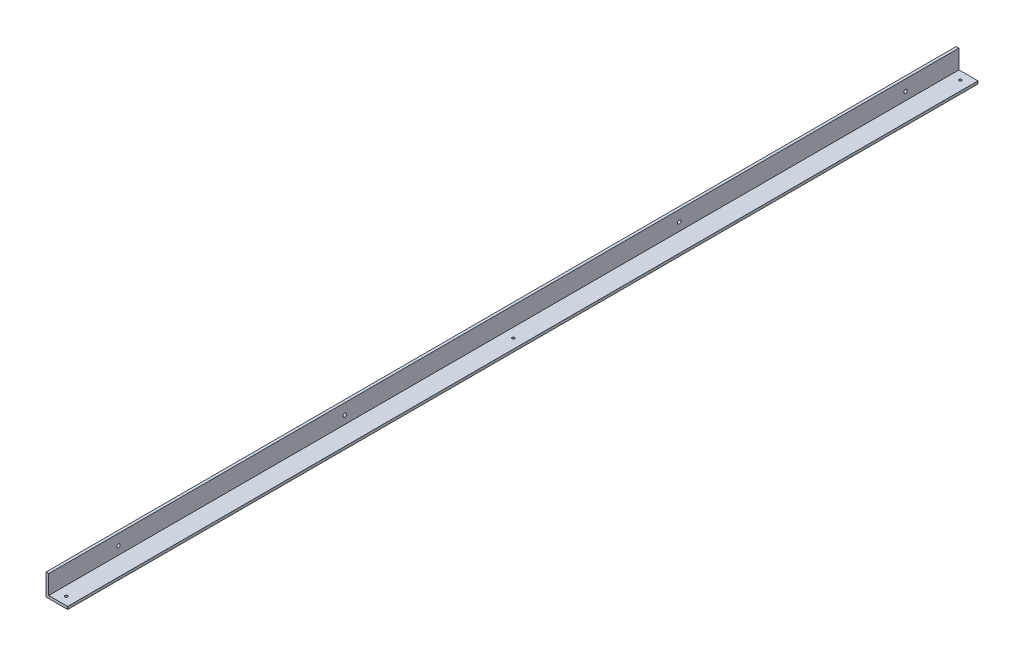
ISO-10303-21;
HEADER;
FILE_DESCRIPTION(('STEP AP214'),'2;1');
FILE_NAME('part.step','',(''),(''),'','','');
FILE_SCHEMA(('AUTOMOTIVE_DESIGN { 1 0 10303 214 1 1 1 1 }'));
ENDSEC;
DATA;
#1=APPLICATION_CONTEXT('core data for automotive mechanical design processes');
#2=APPLICATION_PROTOCOL_DEFINITION('international standard','automotive_design',2000,#1);
#3=PRODUCT_CONTEXT('',#1,'mechanical');
#4=PRODUCT('Part','Part','',(#3));
#5=PRODUCT_RELATED_PRODUCT_CATEGORY('part','',(#4));
#6=PRODUCT_DEFINITION_FORMATION('','',#4);
#7=PRODUCT_DEFINITION_CONTEXT('part definition',#1,'design');
#8=PRODUCT_DEFINITION('design','',#6,#7);
#9=PRODUCT_DEFINITION_SHAPE('','',#8);
#10=(LENGTH_UNIT() NAMED_UNIT(*) SI_UNIT(.MILLI.,.METRE.));
#11=(NAMED_UNIT(*) PLANE_ANGLE_UNIT() SI_UNIT($,.RADIAN.));
#12=(NAMED_UNIT(*) SI_UNIT($,.STERADIAN.) SOLID_ANGLE_UNIT());
#13=UNCERTAINTY_MEASURE_WITH_UNIT(LENGTH_MEASURE(1.E-05),#10,'distance_accuracy_value','');
#14=(GEOMETRIC_REPRESENTATION_CONTEXT(3) GLOBAL_UNCERTAINTY_ASSIGNED_CONTEXT((#13)) GLOBAL_UNIT_ASSIGNED_CONTEXT((#10,
#11,#12)) REPRESENTATION_CONTEXT('',''));
#15=CARTESIAN_POINT('',(0.,0.,0.));
#16=DIRECTION('',(0.,0.,1.));
#17=DIRECTION('',(1.,0.,0.));
#18=AXIS2_PLACEMENT_3D('',#15,#16,#17);
#19=CARTESIAN_POINT('',(0.,0.,3360.));
#20=DIRECTION('',(1.,0.,0.));
#21=DIRECTION('',(0.,0.,-1.));
#22=AXIS2_PLACEMENT_3D('',#19,#20,#21);
#23=PLANE('',#22);
#24=CARTESIAN_POINT('',(0.,40.,3102.5));
#25=DIRECTION('',(-1.,0.,0.));
#26=DIRECTION('',(0.,0.,1.));
#27=AXIS2_PLACEMENT_3D('',#24,#25,#26);
#28=CIRCLE('',#27,6.34999999999972);
#29=CARTESIAN_POINT('',(0.,40.,3108.85));
#30=VERTEX_POINT('',#29);
#31=EDGE_CURVE('E183',#30,#30,#28,.T.);
#32=ORIENTED_EDGE('',*,*,#31,.F.);
#33=EDGE_LOOP('',(#32));
#34=FACE_BOUND('',#33,.T.);
#35=CARTESIAN_POINT('',(0.,40.,2267.5));
#36=DIRECTION('',(-1.,0.,0.));
#37=DIRECTION('',(0.,0.,1.));
#38=AXIS2_PLACEMENT_3D('',#35,#36,#37);
#39=CIRCLE('',#38,6.34999999999972);
#40=CARTESIAN_POINT('',(0.,40.,2273.85));
#41=VERTEX_POINT('',#40);
#42=EDGE_CURVE('E187',#41,#41,#39,.T.);
#43=ORIENTED_EDGE('',*,*,#42,.F.);
#44=EDGE_LOOP('',(#43));
#45=FACE_BOUND('',#44,.T.);
#46=CARTESIAN_POINT('',(0.,40.,1032.5));
#47=DIRECTION('',(-1.,0.,0.));
#48=DIRECTION('',(0.,0.,1.));
#49=AXIS2_PLACEMENT_3D('',#46,#47,#48);
#50=CIRCLE('',#49,6.35000000000016);
#51=CARTESIAN_POINT('',(0.,40.,1038.85));
#52=VERTEX_POINT('',#51);
#53=EDGE_CURVE('E191',#52,#52,#50,.T.);
#54=ORIENTED_EDGE('',*,*,#53,.F.);
#55=EDGE_LOOP('',(#54));
#56=FACE_BOUND('',#55,.T.);
#57=CARTESIAN_POINT('',(0.,40.,197.5));
#58=DIRECTION('',(-1.,0.,0.));
#59=DIRECTION('',(0.,0.,1.));
#60=AXIS2_PLACEMENT_3D('',#57,#58,#59);
#61=CIRCLE('',#60,6.35000000000017);
#62=CARTESIAN_POINT('',(0.,40.,203.85));
#63=VERTEX_POINT('',#62);
#64=EDGE_CURVE('E194',#63,#63,#61,.T.);
#65=ORIENTED_EDGE('',*,*,#64,.F.);
#66=EDGE_LOOP('',(#65));
#67=FACE_BOUND('',#66,.T.);
#68=DIRECTION('',(0.,-1.,0.));
#69=VECTOR('',#68,1.);
#70=CARTESIAN_POINT('',(0.,0.,0.));
#71=LINE('',#70,#69);
#72=CARTESIAN_POINT('',(0.,80.,0.));
#73=VERTEX_POINT('',#72);
#74=CARTESIAN_POINT('',(0.,0.,0.));
#75=VERTEX_POINT('',#74);
#76=EDGE_CURVE('E127',#73,#75,#71,.T.);
#77=ORIENTED_EDGE('',*,*,#76,.T.);
#78=DIRECTION('',(0.,0.,-1.));
#79=VECTOR('',#78,1.);
#80=CARTESIAN_POINT('',(0.,0.,3360.));
#81=LINE('',#80,#79);
#82=CARTESIAN_POINT('',(0.,0.,3360.));
#83=VERTEX_POINT('',#82);
#84=EDGE_CURVE('E11',#83,#75,#81,.T.);
#85=ORIENTED_EDGE('',*,*,#84,.F.);
#86=DIRECTION('',(0.,-1.,0.));
#87=VECTOR('',#86,1.);
#88=CARTESIAN_POINT('',(0.,0.,3360.));
#89=LINE('',#88,#87);
#90=CARTESIAN_POINT('',(0.,80.,3360.));
#91=VERTEX_POINT('',#90);
#92=EDGE_CURVE('E144',#91,#83,#89,.T.);
#93=ORIENTED_EDGE('',*,*,#92,.F.);
#94=DIRECTION('',(0.,0.,-1.));
#95=VECTOR('',#94,1.);
#96=CARTESIAN_POINT('',(0.,80.,3360.));
#97=LINE('',#96,#95);
#98=EDGE_CURVE('E123',#91,#73,#97,.T.);
#99=ORIENTED_EDGE('',*,*,#98,.T.);
#100=EDGE_LOOP('',(#77,#85,#93,#99));
#101=FACE_BOUND('',#100,.T.);
#102=ADVANCED_FACE('F38',(#34,#45,#56,#67,#101),#23,.F.);
#103=CARTESIAN_POINT('',(0.,0.,3360.));
#104=DIRECTION('',(0.,1.,0.));
#105=DIRECTION('',(0.,0.,1.));
#106=AXIS2_PLACEMENT_3D('',#103,#104,#105);
#107=PLANE('',#106);
#108=CARTESIAN_POINT('',(45.,0.,3330.));
#109=DIRECTION('',(0.,1.,0.));
#110=DIRECTION('',(0.,0.,1.));
#111=AXIS2_PLACEMENT_3D('',#108,#109,#110);
#112=CIRCLE('',#111,4.76250000000001);
#113=CARTESIAN_POINT('',(45.,0.,3334.7625));
#114=VERTEX_POINT('',#113);
#115=EDGE_CURVE('E198',#114,#114,#112,.F.);
#116=ORIENTED_EDGE('',*,*,#115,.F.);
#117=EDGE_LOOP('',(#116));
#118=FACE_BOUND('',#117,.T.);
#119=CARTESIAN_POINT('',(45.,0.,1680.));
#120=DIRECTION('',(0.,1.,0.));
#121=DIRECTION('',(0.,0.,1.));
#122=AXIS2_PLACEMENT_3D('',#119,#120,#121);
#123=CIRCLE('',#122,4.76250000000002);
#124=CARTESIAN_POINT('',(45.,0.,1684.7625));
#125=VERTEX_POINT('',#124);
#126=EDGE_CURVE('E240',#125,#125,#123,.F.);
#127=ORIENTED_EDGE('',*,*,#126,.F.);
#128=EDGE_LOOP('',(#127));
#129=FACE_BOUND('',#128,.T.);
#130=CARTESIAN_POINT('',(45.,0.,30.0000000000002));
#131=DIRECTION('',(0.,1.,0.));
#132=DIRECTION('',(0.,0.,1.));
#133=AXIS2_PLACEMENT_3D('',#130,#131,#132);
#134=CIRCLE('',#133,4.7625);
#135=CARTESIAN_POINT('',(45.,0.,34.7625000000003));
#136=VERTEX_POINT('',#135);
#137=EDGE_CURVE('E231',#136,#136,#134,.F.);
#138=ORIENTED_EDGE('',*,*,#137,.F.);
#139=EDGE_LOOP('',(#138));
#140=FACE_BOUND('',#139,.T.);
#141=DIRECTION('',(1.,0.,0.));
#142=VECTOR('',#141,1.);
#143=CARTESIAN_POINT('',(0.,0.,0.));
#144=LINE('',#143,#142);
#145=CARTESIAN_POINT('',(80.,0.,0.));
#146=VERTEX_POINT('',#145);
#147=EDGE_CURVE('E131',#75,#146,#144,.T.);
#148=ORIENTED_EDGE('',*,*,#147,.T.);
#149=DIRECTION('',(0.,0.,-1.));
#150=VECTOR('',#149,1.);
#151=CARTESIAN_POINT('',(80.,0.,3360.));
#152=LINE('',#151,#150);
#153=CARTESIAN_POINT('',(80.,0.,3360.));
#154=VERTEX_POINT('',#153);
#155=EDGE_CURVE('E47',#154,#146,#152,.T.);
#156=ORIENTED_EDGE('',*,*,#155,.F.);
#157=DIRECTION('',(1.,0.,0.));
#158=VECTOR('',#157,1.);
#159=CARTESIAN_POINT('',(0.,0.,3360.));
#160=LINE('',#159,#158);
#161=EDGE_CURVE('E92',#83,#154,#160,.T.);
#162=ORIENTED_EDGE('',*,*,#161,.F.);
#163=ORIENTED_EDGE('',*,*,#84,.T.);
#164=EDGE_LOOP('',(#148,#156,#162,#163));
#165=FACE_BOUND('',#164,.T.);
#166=ADVANCED_FACE('F173',(#118,#129,#140,#165),#107,.F.);
#167=CARTESIAN_POINT('',(80.,10.,3360.));
#168=DIRECTION('',(-1.,0.,0.));
#169=DIRECTION('',(0.,0.,1.));
#170=AXIS2_PLACEMENT_3D('',#167,#168,#169);
#171=PLANE('',#170);
#172=DIRECTION('',(0.,1.,0.));
#173=VECTOR('',#172,1.);
#174=CARTESIAN_POINT('',(80.,10.,0.));
#175=LINE('',#174,#173);
#176=CARTESIAN_POINT('',(80.,10.,0.));
#177=VERTEX_POINT('',#176);
#178=EDGE_CURVE('E135',#146,#177,#175,.T.);
#179=ORIENTED_EDGE('',*,*,#178,.T.);
#180=DIRECTION('',(0.,0.,-1.));
#181=VECTOR('',#180,1.);
#182=CARTESIAN_POINT('',(80.,10.,3360.));
#183=LINE('',#182,#181);
#184=CARTESIAN_POINT('',(80.,10.,3360.));
#185=VERTEX_POINT('',#184);
#186=EDGE_CURVE('E116',#185,#177,#183,.T.);
#187=ORIENTED_EDGE('',*,*,#186,.F.);
#188=DIRECTION('',(0.,1.,0.));
#189=VECTOR('',#188,1.);
#190=CARTESIAN_POINT('',(80.,10.,3360.));
#191=LINE('',#190,#189);
#192=EDGE_CURVE('E105',#154,#185,#191,.T.);
#193=ORIENTED_EDGE('',*,*,#192,.F.);
#194=ORIENTED_EDGE('',*,*,#155,.T.);
#195=EDGE_LOOP('',(#179,#187,#193,#194));
#196=FACE_BOUND('',#195,.T.);
#197=ADVANCED_FACE('F154',(#196),#171,.F.);
#198=CARTESIAN_POINT('',(10.,10.,3360.));
#199=DIRECTION('',(0.,-1.,0.));
#200=DIRECTION('',(0.,0.,-1.));
#201=AXIS2_PLACEMENT_3D('',#198,#199,#200);
#202=PLANE('',#201);
#203=CARTESIAN_POINT('',(45.,10.,3330.));
#204=DIRECTION('',(0.,1.,0.));
#205=DIRECTION('',(0.,0.,1.));
#206=AXIS2_PLACEMENT_3D('',#203,#204,#205);
#207=CIRCLE('',#206,4.76250000000001);
#208=CARTESIAN_POINT('',(45.,10.,3334.7625));
#209=VERTEX_POINT('',#208);
#210=EDGE_CURVE('E205',#209,#209,#207,.T.);
#211=ORIENTED_EDGE('',*,*,#210,.F.);
#212=EDGE_LOOP('',(#211));
#213=FACE_BOUND('',#212,.T.);
#214=CARTESIAN_POINT('',(45.,10.,1680.));
#215=DIRECTION('',(0.,1.,0.));
#216=DIRECTION('',(0.,0.,1.));
#217=AXIS2_PLACEMENT_3D('',#214,#215,#216);
#218=CIRCLE('',#217,4.76250000000002);
#219=CARTESIAN_POINT('',(45.,10.,1684.7625));
#220=VERTEX_POINT('',#219);
#221=EDGE_CURVE('E235',#220,#220,#218,.T.);
#222=ORIENTED_EDGE('',*,*,#221,.F.);
#223=EDGE_LOOP('',(#222));
#224=FACE_BOUND('',#223,.T.);
#225=CARTESIAN_POINT('',(45.,10.,30.0000000000002));
#226=DIRECTION('',(0.,1.,0.));
#227=DIRECTION('',(0.,0.,1.));
#228=AXIS2_PLACEMENT_3D('',#225,#226,#227);
#229=CIRCLE('',#228,4.7625);
#230=CARTESIAN_POINT('',(45.,10.,34.7625000000003));
#231=VERTEX_POINT('',#230);
#232=EDGE_CURVE('E236',#231,#231,#229,.T.);
#233=ORIENTED_EDGE('',*,*,#232,.F.);
#234=EDGE_LOOP('',(#233));
#235=FACE_BOUND('',#234,.T.);
#236=DIRECTION('',(-1.,0.,0.));
#237=VECTOR('',#236,1.);
#238=CARTESIAN_POINT('',(10.,10.,0.));
#239=LINE('',#238,#237);
#240=CARTESIAN_POINT('',(10.,10.,0.));
#241=VERTEX_POINT('',#240);
#242=EDGE_CURVE('E114',#177,#241,#239,.T.);
#243=ORIENTED_EDGE('',*,*,#242,.T.);
#244=DIRECTION('',(0.,0.,-1.));
#245=VECTOR('',#244,1.);
#246=CARTESIAN_POINT('',(10.,10.,3360.));
#247=LINE('',#246,#245);
#248=CARTESIAN_POINT('',(10.,10.,3360.));
#249=VERTEX_POINT('',#248);
#250=EDGE_CURVE('E111',#249,#241,#247,.T.);
#251=ORIENTED_EDGE('',*,*,#250,.F.);
#252=DIRECTION('',(-1.,0.,0.));
#253=VECTOR('',#252,1.);
#254=CARTESIAN_POINT('',(10.,10.,3360.));
#255=LINE('',#254,#253);
#256=EDGE_CURVE('E99',#185,#249,#255,.T.);
#257=ORIENTED_EDGE('',*,*,#256,.F.);
#258=ORIENTED_EDGE('',*,*,#186,.T.);
#259=EDGE_LOOP('',(#243,#251,#257,#258));
#260=FACE_BOUND('',#259,.T.);
#261=ADVANCED_FACE('F112',(#213,#224,#235,#260),#202,.F.);
#262=CARTESIAN_POINT('',(10.,80.,3360.));
#263=DIRECTION('',(-1.,0.,0.));
#264=DIRECTION('',(0.,-1.,0.));
#265=AXIS2_PLACEMENT_3D('',#262,#263,#264);
#266=PLANE('',#265);
#267=CARTESIAN_POINT('',(9.99999999999999,40.,3102.5));
#268=DIRECTION('',(-1.,0.,0.));
#269=DIRECTION('',(0.,-1.,0.));
#270=AXIS2_PLACEMENT_3D('',#267,#268,#269);
#271=CIRCLE('',#270,6.34999999999972);
#272=CARTESIAN_POINT('',(9.99999999999999,33.6500000000003,3102.5));
#273=VERTEX_POINT('',#272);
#274=EDGE_CURVE('E132',#273,#273,#271,.F.);
#275=ORIENTED_EDGE('',*,*,#274,.F.);
#276=EDGE_LOOP('',(#275));
#277=FACE_BOUND('',#276,.T.);
#278=CARTESIAN_POINT('',(9.99999999999999,40.,2267.5));
#279=DIRECTION('',(-1.,0.,0.));
#280=DIRECTION('',(0.,-1.,0.));
#281=AXIS2_PLACEMENT_3D('',#278,#279,#280);
#282=CIRCLE('',#281,6.34999999999972);
#283=CARTESIAN_POINT('',(9.99999999999999,33.6500000000003,2267.5));
#284=VERTEX_POINT('',#283);
#285=EDGE_CURVE('E220',#284,#284,#282,.F.);
#286=ORIENTED_EDGE('',*,*,#285,.F.);
#287=EDGE_LOOP('',(#286));
#288=FACE_BOUND('',#287,.T.);
#289=CARTESIAN_POINT('',(9.99999999999999,40.,1032.5));
#290=DIRECTION('',(-1.,0.,0.));
#291=DIRECTION('',(0.,-1.,0.));
#292=AXIS2_PLACEMENT_3D('',#289,#290,#291);
#293=CIRCLE('',#292,6.35000000000016);
#294=CARTESIAN_POINT('',(9.99999999999999,33.6499999999998,1032.5));
#295=VERTEX_POINT('',#294);
#296=EDGE_CURVE('E208',#295,#295,#293,.F.);
#297=ORIENTED_EDGE('',*,*,#296,.F.);
#298=EDGE_LOOP('',(#297));
#299=FACE_BOUND('',#298,.T.);
#300=CARTESIAN_POINT('',(9.99999999999999,40.,197.5));
#301=DIRECTION('',(-1.,0.,0.));
#302=DIRECTION('',(0.,-1.,0.));
#303=AXIS2_PLACEMENT_3D('',#300,#301,#302);
#304=CIRCLE('',#303,6.35000000000017);
#305=CARTESIAN_POINT('',(9.99999999999999,33.6499999999998,197.5));
#306=VERTEX_POINT('',#305);
#307=EDGE_CURVE('E197',#306,#306,#304,.F.);
#308=ORIENTED_EDGE('',*,*,#307,.F.);
#309=EDGE_LOOP('',(#308));
#310=FACE_BOUND('',#309,.T.);
#311=DIRECTION('',(0.,1.,0.));
#312=VECTOR('',#311,1.);
#313=CARTESIAN_POINT('',(10.,80.,0.));
#314=LINE('',#313,#312);
#315=CARTESIAN_POINT('',(10.,80.,0.));
#316=VERTEX_POINT('',#315);
#317=EDGE_CURVE('E78',#241,#316,#314,.T.);
#318=ORIENTED_EDGE('',*,*,#317,.T.);
#319=DIRECTION('',(0.,0.,-1.));
#320=VECTOR('',#319,1.);
#321=CARTESIAN_POINT('',(10.,80.,3360.));
#322=LINE('',#321,#320);
#323=CARTESIAN_POINT('',(10.,80.,3360.));
#324=VERTEX_POINT('',#323);
#325=EDGE_CURVE('E117',#324,#316,#322,.T.);
#326=ORIENTED_EDGE('',*,*,#325,.F.);
#327=DIRECTION('',(0.,1.,0.));
#328=VECTOR('',#327,1.);
#329=CARTESIAN_POINT('',(10.,80.,3360.));
#330=LINE('',#329,#328);
#331=EDGE_CURVE('E103',#249,#324,#330,.T.);
#332=ORIENTED_EDGE('',*,*,#331,.F.);
#333=ORIENTED_EDGE('',*,*,#250,.T.);
#334=EDGE_LOOP('',(#318,#326,#332,#333));
#335=FACE_BOUND('',#334,.T.);
#336=ADVANCED_FACE('F119',(#277,#288,#299,#310,#335),#266,.F.);
#337=CARTESIAN_POINT('',(0.,80.,3360.));
#338=DIRECTION('',(0.,-1.,0.));
#339=DIRECTION('',(0.,0.,-1.));
#340=AXIS2_PLACEMENT_3D('',#337,#338,#339);
#341=PLANE('',#340);
#342=DIRECTION('',(-1.,0.,0.));
#343=VECTOR('',#342,1.);
#344=CARTESIAN_POINT('',(0.,80.,0.));
#345=LINE('',#344,#343);
#346=EDGE_CURVE('E84',#316,#73,#345,.T.);
#347=ORIENTED_EDGE('',*,*,#346,.T.);
#348=ORIENTED_EDGE('',*,*,#98,.F.);
#349=DIRECTION('',(-1.,0.,0.));
#350=VECTOR('',#349,1.);
#351=CARTESIAN_POINT('',(0.,80.,3360.));
#352=LINE('',#351,#350);
#353=EDGE_CURVE('E55',#324,#91,#352,.T.);
#354=ORIENTED_EDGE('',*,*,#353,.F.);
#355=ORIENTED_EDGE('',*,*,#325,.T.);
#356=EDGE_LOOP('',(#347,#348,#354,#355));
#357=FACE_BOUND('',#356,.T.);
#358=ADVANCED_FACE('F161',(#357),#341,.F.);
#359=CARTESIAN_POINT('',(0.,0.,3360.));
#360=DIRECTION('',(0.,0.,-1.));
#361=DIRECTION('',(-1.,0.,0.));
#362=AXIS2_PLACEMENT_3D('',#359,#360,#361);
#363=PLANE('',#362);
#364=ORIENTED_EDGE('',*,*,#92,.T.);
#365=ORIENTED_EDGE('',*,*,#161,.T.);
#366=ORIENTED_EDGE('',*,*,#192,.T.);
#367=ORIENTED_EDGE('',*,*,#256,.T.);
#368=ORIENTED_EDGE('',*,*,#331,.T.);
#369=ORIENTED_EDGE('',*,*,#353,.T.);
#370=EDGE_LOOP('',(#364,#365,#366,#367,#368,#369));
#371=FACE_BOUND('',#370,.T.);
#372=ADVANCED_FACE('F101',(#371),#363,.F.);
#373=CARTESIAN_POINT('',(0.,0.,0.));
#374=DIRECTION('',(0.,0.,-1.));
#375=DIRECTION('',(-1.,0.,0.));
#376=AXIS2_PLACEMENT_3D('',#373,#374,#375);
#377=PLANE('',#376);
#378=ORIENTED_EDGE('',*,*,#76,.F.);
#379=ORIENTED_EDGE('',*,*,#346,.F.);
#380=ORIENTED_EDGE('',*,*,#317,.F.);
#381=ORIENTED_EDGE('',*,*,#242,.F.);
#382=ORIENTED_EDGE('',*,*,#178,.F.);
#383=ORIENTED_EDGE('',*,*,#147,.F.);
#384=EDGE_LOOP('',(#378,#379,#380,#381,#382,#383));
#385=FACE_BOUND('',#384,.T.);
#386=ADVANCED_FACE('F157',(#385),#377,.T.);
#387=CARTESIAN_POINT('',(80.001,40.,197.5));
#388=DIRECTION('',(-1.,0.,0.));
#389=DIRECTION('',(0.,0.,1.));
#390=AXIS2_PLACEMENT_3D('',#387,#388,#389);
#391=CYLINDRICAL_SURFACE('',#390,6.35000000000017);
#392=ORIENTED_EDGE('',*,*,#64,.T.);
#393=EDGE_LOOP('',(#392));
#394=FACE_BOUND('',#393,.T.);
#395=ORIENTED_EDGE('',*,*,#307,.T.);
#396=EDGE_LOOP('',(#395));
#397=FACE_BOUND('',#396,.T.);
#398=ADVANCED_FACE('F286',(#394,#397),#391,.F.);
#399=CARTESIAN_POINT('',(80.001,40.,1032.5));
#400=DIRECTION('',(-1.,0.,0.));
#401=DIRECTION('',(0.,0.,1.));
#402=AXIS2_PLACEMENT_3D('',#399,#400,#401);
#403=CYLINDRICAL_SURFACE('',#402,6.35000000000016);
#404=ORIENTED_EDGE('',*,*,#53,.T.);
#405=EDGE_LOOP('',(#404));
#406=FACE_BOUND('',#405,.T.);
#407=ORIENTED_EDGE('',*,*,#296,.T.);
#408=EDGE_LOOP('',(#407));
#409=FACE_BOUND('',#408,.T.);
#410=ADVANCED_FACE('F282',(#406,#409),#403,.F.);
#411=CARTESIAN_POINT('',(80.001,40.,2267.5));
#412=DIRECTION('',(-1.,0.,0.));
#413=DIRECTION('',(0.,0.,1.));
#414=AXIS2_PLACEMENT_3D('',#411,#412,#413);
#415=CYLINDRICAL_SURFACE('',#414,6.34999999999972);
#416=ORIENTED_EDGE('',*,*,#42,.T.);
#417=EDGE_LOOP('',(#416));
#418=FACE_BOUND('',#417,.T.);
#419=ORIENTED_EDGE('',*,*,#285,.T.);
#420=EDGE_LOOP('',(#419));
#421=FACE_BOUND('',#420,.T.);
#422=ADVANCED_FACE('F275',(#418,#421),#415,.F.);
#423=CARTESIAN_POINT('',(80.001,40.,3102.5));
#424=DIRECTION('',(-1.,0.,0.));
#425=DIRECTION('',(0.,0.,1.));
#426=AXIS2_PLACEMENT_3D('',#423,#424,#425);
#427=CYLINDRICAL_SURFACE('',#426,6.34999999999972);
#428=ORIENTED_EDGE('',*,*,#31,.T.);
#429=EDGE_LOOP('',(#428));
#430=FACE_BOUND('',#429,.T.);
#431=ORIENTED_EDGE('',*,*,#274,.T.);
#432=EDGE_LOOP('',(#431));
#433=FACE_BOUND('',#432,.T.);
#434=ADVANCED_FACE('F265',(#430,#433),#427,.F.);
#435=CARTESIAN_POINT('',(45.,-0.000999999999999265,30.0000000000002));
#436=DIRECTION('',(0.,1.,0.));
#437=DIRECTION('',(0.,0.,1.));
#438=AXIS2_PLACEMENT_3D('',#435,#436,#437);
#439=CYLINDRICAL_SURFACE('',#438,4.7625);
#440=ORIENTED_EDGE('',*,*,#232,.T.);
#441=EDGE_LOOP('',(#440));
#442=FACE_BOUND('',#441,.T.);
#443=ORIENTED_EDGE('',*,*,#137,.T.);
#444=EDGE_LOOP('',(#443));
#445=FACE_BOUND('',#444,.T.);
#446=ADVANCED_FACE('F261',(#442,#445),#439,.F.);
#447=CARTESIAN_POINT('',(45.,-0.000999999999999265,1680.));
#448=DIRECTION('',(0.,1.,0.));
#449=DIRECTION('',(0.,0.,1.));
#450=AXIS2_PLACEMENT_3D('',#447,#448,#449);
#451=CYLINDRICAL_SURFACE('',#450,4.76250000000002);
#452=ORIENTED_EDGE('',*,*,#221,.T.);
#453=EDGE_LOOP('',(#452));
#454=FACE_BOUND('',#453,.T.);
#455=ORIENTED_EDGE('',*,*,#126,.T.);
#456=EDGE_LOOP('',(#455));
#457=FACE_BOUND('',#456,.T.);
#458=ADVANCED_FACE('F264',(#454,#457),#451,.F.);
#459=CARTESIAN_POINT('',(45.,-0.000999999999999265,3330.));
#460=DIRECTION('',(0.,1.,0.));
#461=DIRECTION('',(0.,0.,1.));
#462=AXIS2_PLACEMENT_3D('',#459,#460,#461);
#463=CYLINDRICAL_SURFACE('',#462,4.76250000000001);
#464=ORIENTED_EDGE('',*,*,#210,.T.);
#465=EDGE_LOOP('',(#464));
#466=FACE_BOUND('',#465,.T.);
#467=ORIENTED_EDGE('',*,*,#115,.T.);
#468=EDGE_LOOP('',(#467));
#469=FACE_BOUND('',#468,.T.);
#470=ADVANCED_FACE('F251',(#466,#469),#463,.F.);
#471=CLOSED_SHELL('',(#102,#166,#197,#261,#336,#358,#372,#386,#398,#410,#422,#434,#446,#458,#470));
#472=MANIFOLD_SOLID_BREP('B2',#471);
#473=ADVANCED_BREP_SHAPE_REPRESENTATION('',(#18,#472),#14);
#474=SHAPE_DEFINITION_REPRESENTATION(#9,#473);
ENDSEC;
END-ISO-10303-21;
